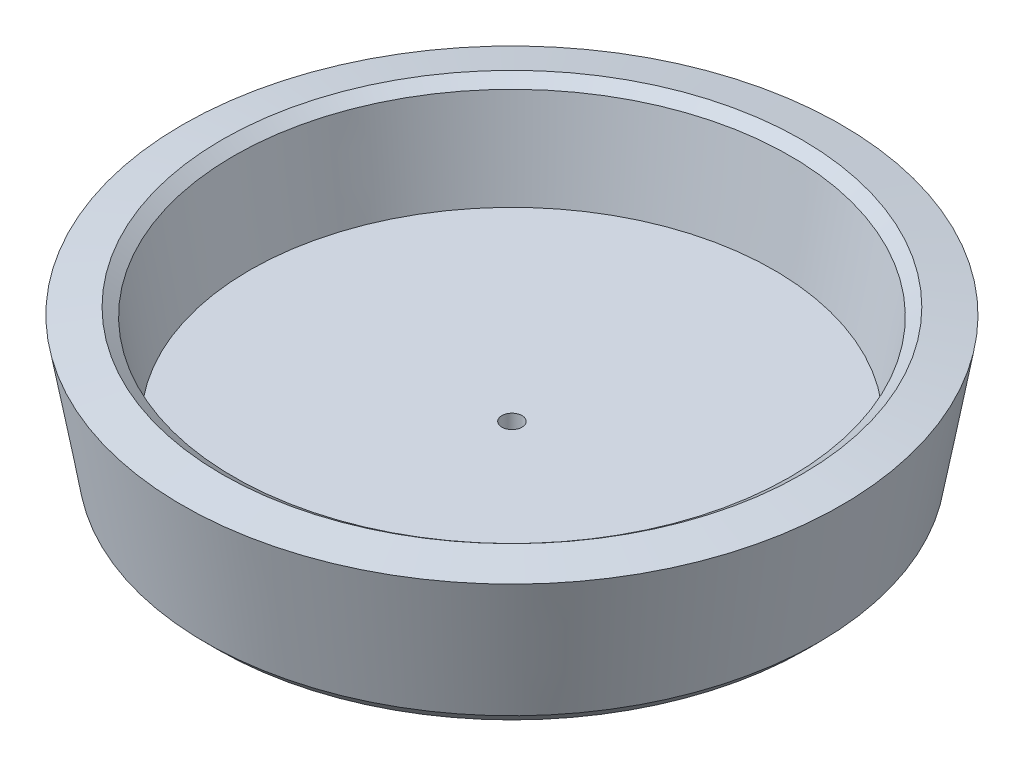
ISO-10303-21;
HEADER;
FILE_DESCRIPTION(('STEP AP214'),'2;1');
FILE_NAME('part.step','',(''),(''),'','','');
FILE_SCHEMA(('AUTOMOTIVE_DESIGN { 1 0 10303 214 1 1 1 1 }'));
ENDSEC;
DATA;
#1=APPLICATION_CONTEXT('core data for automotive mechanical design processes');
#2=APPLICATION_PROTOCOL_DEFINITION('international standard','automotive_design',2000,#1);
#3=PRODUCT_CONTEXT('',#1,'mechanical');
#4=PRODUCT('Part','Part','',(#3));
#5=PRODUCT_RELATED_PRODUCT_CATEGORY('part','',(#4));
#6=PRODUCT_DEFINITION_FORMATION('','',#4);
#7=PRODUCT_DEFINITION_CONTEXT('part definition',#1,'design');
#8=PRODUCT_DEFINITION('design','',#6,#7);
#9=PRODUCT_DEFINITION_SHAPE('','',#8);
#10=(LENGTH_UNIT() NAMED_UNIT(*) SI_UNIT(.MILLI.,.METRE.));
#11=(NAMED_UNIT(*) PLANE_ANGLE_UNIT() SI_UNIT($,.RADIAN.));
#12=(NAMED_UNIT(*) SI_UNIT($,.STERADIAN.) SOLID_ANGLE_UNIT());
#13=UNCERTAINTY_MEASURE_WITH_UNIT(LENGTH_MEASURE(1.E-05),#10,'distance_accuracy_value','');
#14=(GEOMETRIC_REPRESENTATION_CONTEXT(3) GLOBAL_UNCERTAINTY_ASSIGNED_CONTEXT((#13)) GLOBAL_UNIT_ASSIGNED_CONTEXT((#10,
#11,#12)) REPRESENTATION_CONTEXT('',''));
#15=CARTESIAN_POINT('',(0.,0.,0.));
#16=DIRECTION('',(0.,0.,1.));
#17=DIRECTION('',(1.,0.,0.));
#18=AXIS2_PLACEMENT_3D('',#15,#16,#17);
#19=CARTESIAN_POINT('',(0.,0.,0.));
#20=DIRECTION('',(0.,-1.,0.));
#21=DIRECTION('',(1.,0.,0.));
#22=AXIS2_PLACEMENT_3D('',#19,#20,#21);
#23=PLANE('',#22);
#24=CARTESIAN_POINT('',(0.,0.,0.));
#25=DIRECTION('',(0.,-1.,0.));
#26=DIRECTION('',(1.,0.,0.));
#27=AXIS2_PLACEMENT_3D('',#24,#25,#26);
#28=CIRCLE('',#27,1.);
#29=CARTESIAN_POINT('',(1.,0.,0.));
#30=VERTEX_POINT('',#29);
#31=EDGE_CURVE('E58',#30,#30,#28,.T.);
#32=ORIENTED_EDGE('',*,*,#31,.F.);
#33=EDGE_LOOP('',(#32));
#34=FACE_BOUND('',#33,.T.);
#35=CARTESIAN_POINT('',(0.,0.,0.));
#36=DIRECTION('',(0.,-1.,0.));
#37=DIRECTION('',(1.,0.,0.));
#38=AXIS2_PLACEMENT_3D('',#35,#36,#37);
#39=CIRCLE('',#38,29.1954981558864);
#40=CARTESIAN_POINT('',(29.1954981558864,0.,0.));
#41=VERTEX_POINT('',#40);
#42=EDGE_CURVE('E43',#41,#41,#39,.T.);
#43=ORIENTED_EDGE('',*,*,#42,.T.);
#44=EDGE_LOOP('',(#43));
#45=FACE_BOUND('',#44,.T.);
#46=ADVANCED_FACE('F32',(#34,#45),#23,.T.);
#47=CARTESIAN_POINT('',(0.,14.1317591116653,0.));
#48=DIRECTION('',(0.,1.,0.));
#49=DIRECTION('',(-1.,0.,0.));
#50=AXIS2_PLACEMENT_3D('',#47,#48,#49);
#51=CONICAL_SURFACE('',#50,32.6873085721457,0.174532925199431);
#52=CARTESIAN_POINT('',(0.,1.21407400337106,0.));
#53=DIRECTION('',(0.,-1.,0.));
#54=DIRECTION('',(1.,0.,0.));
#55=AXIS2_PLACEMENT_3D('',#52,#53,#54);
#56=CIRCLE('',#55,30.4095721592575);
#57=CARTESIAN_POINT('',(30.4095721592575,1.21407400337104,0.));
#58=VERTEX_POINT('',#57);
#59=EDGE_CURVE('E47',#58,#58,#56,.F.);
#60=ORIENTED_EDGE('',*,*,#59,.T.);
#61=EDGE_LOOP('',(#60));
#62=FACE_BOUND('',#61,.T.);
#63=CARTESIAN_POINT('',(0.,14.1317591116653,0.));
#64=DIRECTION('',(0.,1.,0.));
#65=DIRECTION('',(-1.,0.,0.));
#66=AXIS2_PLACEMENT_3D('',#63,#64,#65);
#67=CIRCLE('',#66,32.6873085721457);
#68=CARTESIAN_POINT('',(-32.6873085721457,14.1317591116654,0.));
#69=VERTEX_POINT('',#68);
#70=EDGE_CURVE('E52',#69,#69,#67,.T.);
#71=ORIENTED_EDGE('',*,*,#70,.F.);
#72=EDGE_LOOP('',(#71));
#73=FACE_BOUND('',#72,.T.);
#74=ADVANCED_FACE('F82',(#62,#73),#51,.T.);
#75=CARTESIAN_POINT('',(0.,15.,0.));
#76=DIRECTION('',(0.,-1.,0.));
#77=DIRECTION('',(1.,0.,0.));
#78=AXIS2_PLACEMENT_3D('',#75,#76,#77);
#79=CONICAL_SURFACE('',#78,27.7632698070846,1.39626340159547);
#80=CARTESIAN_POINT('',(0.,14.826351822333,0.));
#81=DIRECTION('',(0.,1.,0.));
#82=DIRECTION('',(-1.,0.,0.));
#83=AXIS2_PLACEMENT_3D('',#80,#81,#82);
#84=CIRCLE('',#83,28.7480775600968);
#85=CARTESIAN_POINT('',(-28.7480775600968,14.8263518223331,0.));
#86=VERTEX_POINT('',#85);
#87=EDGE_CURVE('E10',#86,#86,#84,.F.);
#88=ORIENTED_EDGE('',*,*,#87,.T.);
#89=EDGE_LOOP('',(#88));
#90=FACE_BOUND('',#89,.T.);
#91=ORIENTED_EDGE('',*,*,#70,.T.);
#92=EDGE_LOOP('',(#91));
#93=FACE_BOUND('',#92,.T.);
#94=ADVANCED_FACE('F76',(#90,#93),#79,.T.);
#95=CARTESIAN_POINT('',(0.,4.99999999999998,0.));
#96=DIRECTION('',(0.,1.,0.));
#97=DIRECTION('',(-1.,0.,0.));
#98=AXIS2_PLACEMENT_3D('',#95,#96,#97);
#99=CONICAL_SURFACE('',#98,26.,0.174532925199431);
#100=CARTESIAN_POINT('',(0.,14.0151922469878,0.));
#101=DIRECTION('',(0.,-1.,0.));
#102=DIRECTION('',(1.,0.,0.));
#103=AXIS2_PLACEMENT_3D('',#100,#101,#102);
#104=CIRCLE('',#103,27.5896216294177);
#105=CARTESIAN_POINT('',(-27.5896216294177,14.0151922469878,0.));
#106=VERTEX_POINT('',#105);
#107=EDGE_CURVE('E39',#106,#106,#104,.F.);
#108=ORIENTED_EDGE('',*,*,#107,.T.);
#109=EDGE_LOOP('',(#108));
#110=FACE_BOUND('',#109,.T.);
#111=CARTESIAN_POINT('',(0.,4.99999999999998,0.));
#112=DIRECTION('',(0.,1.,0.));
#113=DIRECTION('',(-1.,0.,0.));
#114=AXIS2_PLACEMENT_3D('',#111,#112,#113);
#115=CIRCLE('',#114,26.);
#116=CARTESIAN_POINT('',(-26.,5.,0.));
#117=VERTEX_POINT('',#116);
#118=EDGE_CURVE('E55',#117,#117,#115,.T.);
#119=ORIENTED_EDGE('',*,*,#118,.F.);
#120=EDGE_LOOP('',(#119));
#121=FACE_BOUND('',#120,.T.);
#122=ADVANCED_FACE('F71',(#110,#121),#99,.F.);
#123=CARTESIAN_POINT('',(-26.,5.00000000000001,0.));
#124=DIRECTION('',(0.,1.,0.));
#125=DIRECTION('',(-1.,0.,0.));
#126=AXIS2_PLACEMENT_3D('',#123,#124,#125);
#127=PLANE('',#126);
#128=CARTESIAN_POINT('',(0.,4.99999999999999,0.));
#129=DIRECTION('',(0.,1.,0.));
#130=DIRECTION('',(-1.,0.,0.));
#131=AXIS2_PLACEMENT_3D('',#128,#129,#130);
#132=CIRCLE('',#131,1.);
#133=CARTESIAN_POINT('',(-0.999999999999996,4.99999999999999,0.));
#134=VERTEX_POINT('',#133);
#135=EDGE_CURVE('E61',#134,#134,#132,.T.);
#136=ORIENTED_EDGE('',*,*,#135,.F.);
#137=EDGE_LOOP('',(#136));
#138=FACE_BOUND('',#137,.T.);
#139=ORIENTED_EDGE('',*,*,#118,.T.);
#140=EDGE_LOOP('',(#139));
#141=FACE_BOUND('',#140,.T.);
#142=ADVANCED_FACE('F67',(#138,#141),#127,.T.);
#143=CARTESIAN_POINT('',(0.,1.21407400337104,0.));
#144=DIRECTION('',(0.,1.,0.));
#145=DIRECTION('',(-1.,0.,0.));
#146=AXIS2_PLACEMENT_3D('',#143,#144,#145);
#147=CONICAL_SURFACE('',#146,30.4095721592575,0.785398163397454);
#148=ORIENTED_EDGE('',*,*,#42,.F.);
#149=EDGE_LOOP('',(#148));
#150=FACE_BOUND('',#149,.T.);
#151=ORIENTED_EDGE('',*,*,#59,.F.);
#152=EDGE_LOOP('',(#151));
#153=FACE_BOUND('',#152,.T.);
#154=ADVANCED_FACE('F70',(#150,#153),#147,.T.);
#155=CARTESIAN_POINT('',(0.,14.0151922469878,0.));
#156=DIRECTION('',(0.,1.,0.));
#157=DIRECTION('',(-1.,0.,0.));
#158=AXIS2_PLACEMENT_3D('',#155,#156,#157);
#159=CONICAL_SURFACE('',#158,27.5896216294177,0.959931088596887);
#160=CARTESIAN_POINT('',(-28.7480775600968,14.8263518223331,0.));
#161=CARTESIAN_POINT('',(-28.7360103108189,14.8179022434232,0.));
#162=CARTESIAN_POINT('',(-28.723943061541,14.8094526645134,0.));
#163=CARTESIAN_POINT('',(-28.6998085629852,14.7925535066937,0.));
#164=CARTESIAN_POINT('',(-28.6877413137073,14.7841039277838,0.));
#165=CARTESIAN_POINT('',(-28.6636068151515,14.7672047699641,0.));
#166=CARTESIAN_POINT('',(-28.6515395658736,14.7587551910543,0.));
#167=CARTESIAN_POINT('',(-28.6274050673177,14.7418560332346,0.));
#168=CARTESIAN_POINT('',(-28.6153378180398,14.7334064543248,0.));
#169=CARTESIAN_POINT('',(-28.591203319484,14.7165072965051,0.));
#170=CARTESIAN_POINT('',(-28.5791360702061,14.7080577175952,0.));
#171=CARTESIAN_POINT('',(-28.5550015716503,14.6911585597755,0.));
#172=CARTESIAN_POINT('',(-28.5429343223724,14.6827089808657,0.));
#173=CARTESIAN_POINT('',(-28.5187998238166,14.665809823046,0.));
#174=CARTESIAN_POINT('',(-28.5067325745387,14.6573602441361,0.));
#175=CARTESIAN_POINT('',(-28.4825980759829,14.6404610863164,0.));
#176=CARTESIAN_POINT('',(-28.470530826705,14.6320115074066,0.));
#177=CARTESIAN_POINT('',(-28.4463963281491,14.6151123495869,0.));
#178=CARTESIAN_POINT('',(-28.4343290788712,14.6066627706771,0.));
#179=CARTESIAN_POINT('',(-28.4101945803154,14.5897636128574,0.));
#180=CARTESIAN_POINT('',(-28.3981273310375,14.5813140339475,0.));
#181=CARTESIAN_POINT('',(-28.3739928324817,14.5644148761278,0.));
#182=CARTESIAN_POINT('',(-28.3619255832038,14.555965297218,0.));
#183=CARTESIAN_POINT('',(-28.337791084648,14.5390661393983,0.));
#184=CARTESIAN_POINT('',(-28.3257238353701,14.5306165604884,0.));
#185=CARTESIAN_POINT('',(-28.3015893368142,14.5137174026687,0.));
#186=CARTESIAN_POINT('',(-28.2895220875363,14.5052678237589,0.));
#187=CARTESIAN_POINT('',(-28.2653875889805,14.4883686659392,0.));
#188=CARTESIAN_POINT('',(-28.2533203397026,14.4799190870294,0.));
#189=CARTESIAN_POINT('',(-28.2291858411468,14.4630199292097,0.));
#190=CARTESIAN_POINT('',(-28.2171185918689,14.4545703502998,0.));
#191=CARTESIAN_POINT('',(-28.1929840933131,14.4376711924801,0.));
#192=CARTESIAN_POINT('',(-28.1809168440352,14.4292216135703,0.));
#193=CARTESIAN_POINT('',(-28.1567823454793,14.4123224557506,0.));
#194=CARTESIAN_POINT('',(-28.1447150962014,14.4038728768407,0.));
#195=CARTESIAN_POINT('',(-28.1205805976456,14.386973719021,0.));
#196=CARTESIAN_POINT('',(-28.1085133483677,14.3785241401112,0.));
#197=CARTESIAN_POINT('',(-28.0843788498119,14.3616249822915,0.));
#198=CARTESIAN_POINT('',(-28.072311600534,14.3531754033817,0.));
#199=CARTESIAN_POINT('',(-28.0481771019782,14.336276245562,0.));
#200=CARTESIAN_POINT('',(-28.0361098527003,14.3278266666521,0.));
#201=CARTESIAN_POINT('',(-28.0119753541445,14.3109275088324,0.));
#202=CARTESIAN_POINT('',(-27.9999081048665,14.3024779299226,0.));
#203=CARTESIAN_POINT('',(-27.9757736063107,14.2855787721029,0.));
#204=CARTESIAN_POINT('',(-27.9637063570328,14.277129193193,0.));
#205=CARTESIAN_POINT('',(-27.939571858477,14.2602300353733,0.));
#206=CARTESIAN_POINT('',(-27.9275046091991,14.2517804564635,0.));
#207=CARTESIAN_POINT('',(-27.9033701106433,14.2348812986438,0.));
#208=CARTESIAN_POINT('',(-27.8913028613654,14.226431719734,0.));
#209=CARTESIAN_POINT('',(-27.8671683628096,14.2095325619143,0.));
#210=CARTESIAN_POINT('',(-27.8551011135317,14.2010829830044,0.));
#211=CARTESIAN_POINT('',(-27.8309666149758,14.1841838251847,0.));
#212=CARTESIAN_POINT('',(-27.8188993656979,14.1757342462749,0.));
#213=CARTESIAN_POINT('',(-27.7947648671421,14.1588350884552,0.));
#214=CARTESIAN_POINT('',(-27.7826976178642,14.1503855095453,0.));
#215=CARTESIAN_POINT('',(-27.7585631193084,14.1334863517256,0.));
#216=CARTESIAN_POINT('',(-27.7464958700305,14.1250367728158,0.));
#217=CARTESIAN_POINT('',(-27.7223613714747,14.1081376149961,0.));
#218=CARTESIAN_POINT('',(-27.7102941221968,14.0996880360863,0.));
#219=CARTESIAN_POINT('',(-27.6861596236409,14.0827888782666,0.));
#220=CARTESIAN_POINT('',(-27.674092374363,14.0743392993567,0.));
#221=CARTESIAN_POINT('',(-27.6499578758072,14.057440141537,0.));
#222=CARTESIAN_POINT('',(-27.6378906265293,14.0489905626272,0.));
#223=CARTESIAN_POINT('',(-27.6137561279735,14.0320914048075,0.));
#224=CARTESIAN_POINT('',(-27.6016888786956,14.0236418258976,0.));
#225=CARTESIAN_POINT('',(-27.5896216294177,14.0151922469878,0.));
#226=B_SPLINE_CURVE_WITH_KNOTS('',3,(#160,#161,#162,#163,#164,#165,#166,#167,#168,#169,#170,
#171,#172,#173,#174,#175,#176,#177,#178,#179,#180,#181,#182,#183,#184,#185,#186,#187,#188,#189,
#190,#191,#192,#193,#194,#195,#196,#197,#198,#199,#200,#201,#202,#203,#204,#205,#206,#207,#208,
#209,#210,#211,#212,#213,#214,#215,#216,#217,#218,#219,#220,#221,#222,#223,#224,#225),
.UNSPECIFIED.,.F.,.F.,(4,2,2,2,2,2,2,2,2,2,2,2,2,2,2,2,2,2,2,2,2,2,2,2,2,2,2,2,2,2,2,2,4),(0.,
0.044194173824157,0.0883883476483179,0.132582521472476,0.176776695296634,0.220970869120795,
0.265165042944953,0.309359216769114,0.353553390593272,0.397747564417433,0.441941738241591,
0.486135912065751,0.530330085889909,0.57452425971407,0.618718433538227,0.662912607362385,
0.707106781186546,0.751300955010704,0.795495128834865,0.839689302659023,0.883883476483184,
0.928077650307342,0.972271824131502,1.01646599795566,1.06066017177982,1.10485434560398,
1.14904851942814,1.1932426932523,1.23743686707646,1.28163104090062,1.32582521472477,
1.37001938854894,1.41421356237309),.UNSPECIFIED.);
#227=EDGE_CURVE('BSEAM34',#86,#106,#226,.T.);
#228=ORIENTED_EDGE('',*,*,#87,.F.);
#229=ORIENTED_EDGE('',*,*,#107,.F.);
#230=ORIENTED_EDGE('',*,*,#227,.T.);
#231=ORIENTED_EDGE('',*,*,#227,.F.);
#232=EDGE_LOOP('',(#228,#230,#229,#231));
#233=FACE_BOUND('',#232,.T.);
#234=ADVANCED_FACE('F34',(#233),#159,.F.);
#235=CARTESIAN_POINT('',(0.,-5.00000000000001,0.));
#236=DIRECTION('',(0.,1.,0.));
#237=DIRECTION('',(-1.,0.,0.));
#238=AXIS2_PLACEMENT_3D('',#235,#236,#237);
#239=CYLINDRICAL_SURFACE('',#238,1.);
#240=ORIENTED_EDGE('',*,*,#31,.T.);
#241=EDGE_LOOP('',(#240));
#242=FACE_BOUND('',#241,.T.);
#243=ORIENTED_EDGE('',*,*,#135,.T.);
#244=EDGE_LOOP('',(#243));
#245=FACE_BOUND('',#244,.T.);
#246=ADVANCED_FACE('F65',(#242,#245),#239,.F.);
#247=CLOSED_SHELL('',(#46,#74,#94,#122,#142,#154,#234,#246));
#248=MANIFOLD_SOLID_BREP('B2',#247);
#249=ADVANCED_BREP_SHAPE_REPRESENTATION('',(#18,#248),#14);
#250=SHAPE_DEFINITION_REPRESENTATION(#9,#249);
ENDSEC;
END-ISO-10303-21;
